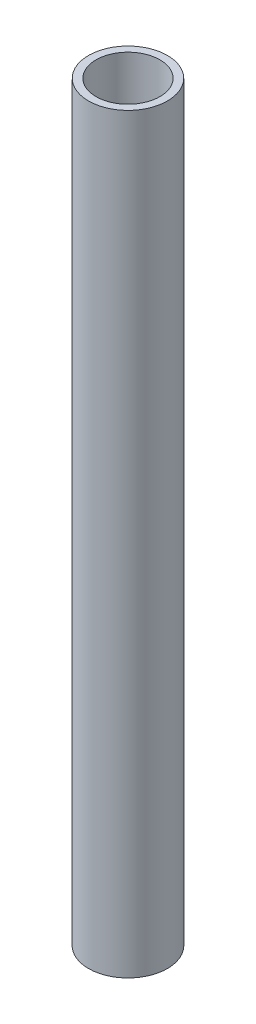
ISO-10303-21;
HEADER;
FILE_DESCRIPTION(('STEP AP214'),'2;1');
FILE_NAME('part.step','',(''),(''),'','','');
FILE_SCHEMA(('AUTOMOTIVE_DESIGN { 1 0 10303 214 1 1 1 1 }'));
ENDSEC;
DATA;
#1=APPLICATION_CONTEXT('core data for automotive mechanical design processes');
#2=APPLICATION_PROTOCOL_DEFINITION('international standard','automotive_design',2000,#1);
#3=PRODUCT_CONTEXT('',#1,'mechanical');
#4=PRODUCT('Part','Part','',(#3));
#5=PRODUCT_RELATED_PRODUCT_CATEGORY('part','',(#4));
#6=PRODUCT_DEFINITION_FORMATION('','',#4);
#7=PRODUCT_DEFINITION_CONTEXT('part definition',#1,'design');
#8=PRODUCT_DEFINITION('design','',#6,#7);
#9=PRODUCT_DEFINITION_SHAPE('','',#8);
#10=(LENGTH_UNIT() NAMED_UNIT(*) SI_UNIT(.MILLI.,.METRE.));
#11=(NAMED_UNIT(*) PLANE_ANGLE_UNIT() SI_UNIT($,.RADIAN.));
#12=(NAMED_UNIT(*) SI_UNIT($,.STERADIAN.) SOLID_ANGLE_UNIT());
#13=UNCERTAINTY_MEASURE_WITH_UNIT(LENGTH_MEASURE(1.E-05),#10,'distance_accuracy_value','');
#14=(GEOMETRIC_REPRESENTATION_CONTEXT(3) GLOBAL_UNCERTAINTY_ASSIGNED_CONTEXT((#13)) GLOBAL_UNIT_ASSIGNED_CONTEXT((#10,
#11,#12)) REPRESENTATION_CONTEXT('',''));
#15=CARTESIAN_POINT('',(0.,0.,0.));
#16=DIRECTION('',(0.,0.,1.));
#17=DIRECTION('',(1.,0.,0.));
#18=AXIS2_PLACEMENT_3D('',#15,#16,#17);
#19=CARTESIAN_POINT('',(0.,200.,0.));
#20=DIRECTION('',(0.,1.,0.));
#21=DIRECTION('',(0.,0.,1.));
#22=AXIS2_PLACEMENT_3D('',#19,#20,#21);
#23=PLANE('',#22);
#24=CARTESIAN_POINT('',(0.,200.,0.));
#25=DIRECTION('',(0.,1.,0.));
#26=DIRECTION('',(0.,0.,1.));
#27=AXIS2_PLACEMENT_3D('',#24,#25,#26);
#28=CIRCLE('',#27,10.5);
#29=CARTESIAN_POINT('',(0.,200.,10.5));
#30=VERTEX_POINT('',#29);
#31=EDGE_CURVE('E10',#30,#30,#28,.T.);
#32=ORIENTED_EDGE('',*,*,#31,.T.);
#33=EDGE_LOOP('',(#32));
#34=FACE_BOUND('',#33,.T.);
#35=CARTESIAN_POINT('',(0.,200.,0.));
#36=DIRECTION('',(0.,1.,0.));
#37=DIRECTION('',(0.,0.,1.));
#38=AXIS2_PLACEMENT_3D('',#35,#36,#37);
#39=CIRCLE('',#38,8.5);
#40=CARTESIAN_POINT('',(0.,200.,8.5));
#41=VERTEX_POINT('',#40);
#42=EDGE_CURVE('E53',#41,#41,#39,.T.);
#43=ORIENTED_EDGE('',*,*,#42,.F.);
#44=EDGE_LOOP('',(#43));
#45=FACE_BOUND('',#44,.T.);
#46=ADVANCED_FACE('F41',(#34,#45),#23,.T.);
#47=CARTESIAN_POINT('',(0.,0.,0.));
#48=DIRECTION('',(0.,1.,0.));
#49=DIRECTION('',(0.,0.,1.));
#50=AXIS2_PLACEMENT_3D('',#47,#48,#49);
#51=PLANE('',#50);
#52=CARTESIAN_POINT('',(0.,0.,0.));
#53=DIRECTION('',(0.,1.,0.));
#54=DIRECTION('',(0.,0.,1.));
#55=AXIS2_PLACEMENT_3D('',#52,#53,#54);
#56=CIRCLE('',#55,10.5);
#57=CARTESIAN_POINT('',(0.,0.,10.5));
#58=VERTEX_POINT('',#57);
#59=EDGE_CURVE('E44',#58,#58,#56,.T.);
#60=ORIENTED_EDGE('',*,*,#59,.F.);
#61=EDGE_LOOP('',(#60));
#62=FACE_BOUND('',#61,.T.);
#63=CARTESIAN_POINT('',(0.,0.,0.));
#64=DIRECTION('',(0.,1.,0.));
#65=DIRECTION('',(0.,0.,1.));
#66=AXIS2_PLACEMENT_3D('',#63,#64,#65);
#67=CIRCLE('',#66,8.5);
#68=CARTESIAN_POINT('',(0.,0.,8.5));
#69=VERTEX_POINT('',#68);
#70=EDGE_CURVE('E57',#69,#69,#67,.T.);
#71=ORIENTED_EDGE('',*,*,#70,.T.);
#72=EDGE_LOOP('',(#71));
#73=FACE_BOUND('',#72,.T.);
#74=ADVANCED_FACE('F66',(#62,#73),#51,.F.);
#75=CARTESIAN_POINT('',(0.,200.,0.));
#76=DIRECTION('',(0.,-1.,0.));
#77=DIRECTION('',(0.,0.,-1.));
#78=AXIS2_PLACEMENT_3D('',#75,#76,#77);
#79=CYLINDRICAL_SURFACE('',#78,10.5);
#80=ORIENTED_EDGE('',*,*,#31,.F.);
#81=EDGE_LOOP('',(#80));
#82=FACE_BOUND('',#81,.T.);
#83=ORIENTED_EDGE('',*,*,#59,.T.);
#84=EDGE_LOOP('',(#83));
#85=FACE_BOUND('',#84,.T.);
#86=ADVANCED_FACE('F43',(#82,#85),#79,.T.);
#87=CARTESIAN_POINT('',(0.,200.,0.));
#88=DIRECTION('',(0.,-1.,0.));
#89=DIRECTION('',(0.,0.,-1.));
#90=AXIS2_PLACEMENT_3D('',#87,#88,#89);
#91=CYLINDRICAL_SURFACE('',#90,8.5);
#92=ORIENTED_EDGE('',*,*,#42,.T.);
#93=EDGE_LOOP('',(#92));
#94=FACE_BOUND('',#93,.T.);
#95=ORIENTED_EDGE('',*,*,#70,.F.);
#96=EDGE_LOOP('',(#95));
#97=FACE_BOUND('',#96,.T.);
#98=ADVANCED_FACE('F63',(#94,#97),#91,.F.);
#99=CLOSED_SHELL('',(#46,#74,#86,#98));
#100=MANIFOLD_SOLID_BREP('B2',#99);
#101=ADVANCED_BREP_SHAPE_REPRESENTATION('',(#18,#100),#14);
#102=SHAPE_DEFINITION_REPRESENTATION(#9,#101);
ENDSEC;
END-ISO-10303-21;
